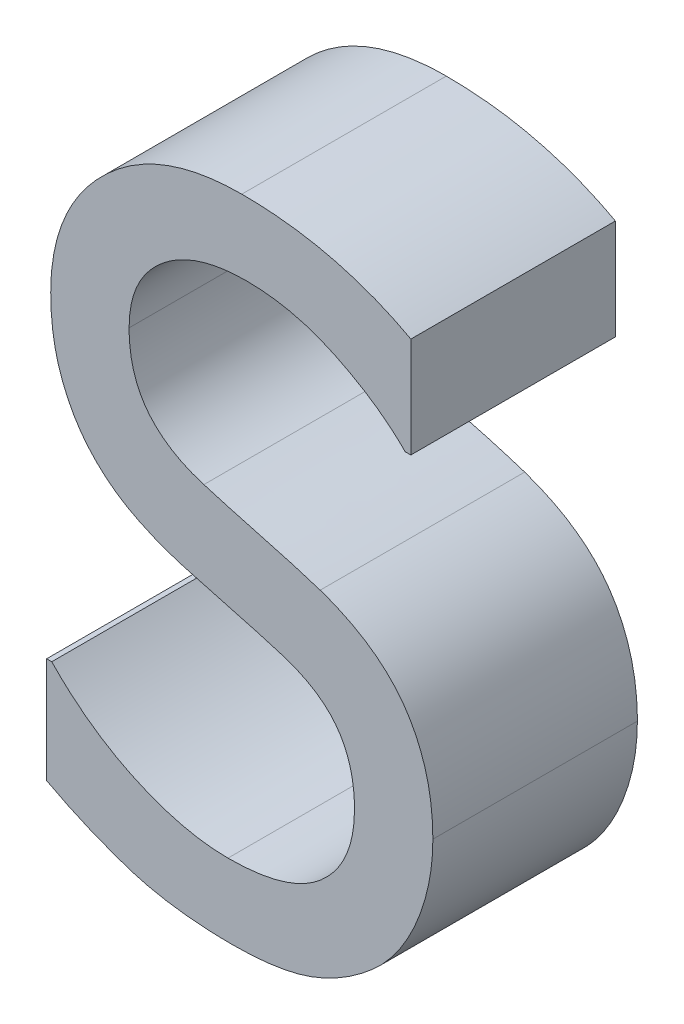
ISO-10303-21;
HEADER;
FILE_DESCRIPTION(('STEP AP214'),'2;1');
FILE_NAME('part.step','',(''),(''),'','','');
FILE_SCHEMA(('AUTOMOTIVE_DESIGN { 1 0 10303 214 1 1 1 1 }'));
ENDSEC;
DATA;
#1=APPLICATION_CONTEXT('core data for automotive mechanical design processes');
#2=APPLICATION_PROTOCOL_DEFINITION('international standard','automotive_design',2000,#1);
#3=PRODUCT_CONTEXT('',#1,'mechanical');
#4=PRODUCT('Part','Part','',(#3));
#5=PRODUCT_RELATED_PRODUCT_CATEGORY('part','',(#4));
#6=PRODUCT_DEFINITION_FORMATION('','',#4);
#7=PRODUCT_DEFINITION_CONTEXT('part definition',#1,'design');
#8=PRODUCT_DEFINITION('design','',#6,#7);
#9=PRODUCT_DEFINITION_SHAPE('','',#8);
#10=(LENGTH_UNIT() NAMED_UNIT(*) SI_UNIT(.MILLI.,.METRE.));
#11=(NAMED_UNIT(*) PLANE_ANGLE_UNIT() SI_UNIT($,.RADIAN.));
#12=(NAMED_UNIT(*) SI_UNIT($,.STERADIAN.) SOLID_ANGLE_UNIT());
#13=UNCERTAINTY_MEASURE_WITH_UNIT(LENGTH_MEASURE(1.E-05),#10,'distance_accuracy_value','');
#14=(GEOMETRIC_REPRESENTATION_CONTEXT(3) GLOBAL_UNCERTAINTY_ASSIGNED_CONTEXT((#13)) GLOBAL_UNIT_ASSIGNED_CONTEXT((#10,
#11,#12)) REPRESENTATION_CONTEXT('',''));
#15=CARTESIAN_POINT('',(0.,0.,0.));
#16=DIRECTION('',(0.,0.,1.));
#17=DIRECTION('',(1.,0.,0.));
#18=AXIS2_PLACEMENT_3D('',#15,#16,#17);
#19=CARTESIAN_POINT('',(-4.806021455057,0.259564190548368,0.));
#20=DIRECTION('',(-1.,0.,0.));
#21=DIRECTION('',(0.,-1.,0.));
#22=AXIS2_PLACEMENT_3D('',#19,#20,#21);
#23=PLANE('',#22);
#24=DIRECTION('',(0.,1.,0.));
#25=VECTOR('',#24,1.);
#26=CARTESIAN_POINT('',(-4.806021455057,0.20796348708896,0.));
#27=LINE('',#26,#25);
#28=CARTESIAN_POINT('',(-4.806021455057,0.20796348708896,0.));
#29=VERTEX_POINT('',#28);
#30=CARTESIAN_POINT('',(-4.806021455057,0.259564190548368,0.));
#31=VERTEX_POINT('',#30);
#32=EDGE_CURVE('E11',#29,#31,#27,.T.);
#33=ORIENTED_EDGE('',*,*,#32,.F.);
#34=DIRECTION('',(0.,0.,1.));
#35=VECTOR('',#34,1.);
#36=CARTESIAN_POINT('',(-4.806021455057,0.20796348708896,0.));
#37=LINE('',#36,#35);
#38=CARTESIAN_POINT('',(-4.806021455057,0.20796348708896,0.1));
#39=VERTEX_POINT('',#38);
#40=EDGE_CURVE('E24',#29,#39,#37,.T.);
#41=ORIENTED_EDGE('',*,*,#40,.T.);
#42=DIRECTION('',(0.,-1.,0.));
#43=VECTOR('',#42,1.);
#44=CARTESIAN_POINT('',(-4.806021455057,0.20796348708896,0.1));
#45=LINE('',#44,#43);
#46=CARTESIAN_POINT('',(-4.806021455057,0.259564190548368,0.1));
#47=VERTEX_POINT('',#46);
#48=EDGE_CURVE('E172',#47,#39,#45,.T.);
#49=ORIENTED_EDGE('',*,*,#48,.F.);
#50=DIRECTION('',(0.,0.,1.));
#51=VECTOR('',#50,1.);
#52=CARTESIAN_POINT('',(-4.806021455057,0.259564190548368,0.));
#53=LINE('',#52,#51);
#54=EDGE_CURVE('E469',#31,#47,#53,.T.);
#55=ORIENTED_EDGE('',*,*,#54,.F.);
#56=EDGE_LOOP('',(#33,#41,#49,#55));
#57=FACE_BOUND('',#56,.T.);
#58=ADVANCED_FACE('F17',(#57),#23,.T.);
#59=CARTESIAN_POINT('',(-4.80351656654,0.259564190548368,0.));
#60=DIRECTION('',(0.,1.,0.));
#61=DIRECTION('',(-1.,0.,0.));
#62=AXIS2_PLACEMENT_3D('',#59,#60,#61);
#63=PLANE('',#62);
#64=DIRECTION('',(1.,0.,0.));
#65=VECTOR('',#64,1.);
#66=CARTESIAN_POINT('',(-4.806021455057,0.259564190548368,0.));
#67=LINE('',#66,#65);
#68=CARTESIAN_POINT('',(-4.80351656654,0.259564190548368,0.));
#69=VERTEX_POINT('',#68);
#70=EDGE_CURVE('E467',#31,#69,#67,.T.);
#71=ORIENTED_EDGE('',*,*,#70,.F.);
#72=ORIENTED_EDGE('',*,*,#54,.T.);
#73=DIRECTION('',(-1.,0.,0.));
#74=VECTOR('',#73,1.);
#75=CARTESIAN_POINT('',(-4.806021455057,0.259564190548368,0.1));
#76=LINE('',#75,#74);
#77=CARTESIAN_POINT('',(-4.80351656654,0.259564190548368,0.1));
#78=VERTEX_POINT('',#77);
#79=EDGE_CURVE('E465',#78,#47,#76,.T.);
#80=ORIENTED_EDGE('',*,*,#79,.F.);
#81=DIRECTION('',(0.,0.,1.));
#82=VECTOR('',#81,1.);
#83=CARTESIAN_POINT('',(-4.80351656654,0.259564190548368,0.));
#84=LINE('',#83,#82);
#85=EDGE_CURVE('E459',#69,#78,#84,.T.);
#86=ORIENTED_EDGE('',*,*,#85,.F.);
#87=EDGE_LOOP('',(#71,#72,#80,#86));
#88=FACE_BOUND('',#87,.T.);
#89=ADVANCED_FACE('F539',(#88),#63,.T.);
#90=CARTESIAN_POINT('',(-4.717348401539,0.219485974269216,0.));
#91=CARTESIAN_POINT('',(-4.717348401539,0.219485974269216,0.1));
#92=CARTESIAN_POINT('',(-4.738890442789,0.219485974269216,0.));
#93=CARTESIAN_POINT('',(-4.738890442789,0.219485974269216,0.1));
#94=CARTESIAN_POINT('',(-4.785230880362,0.240527037815771,0.));
#95=CARTESIAN_POINT('',(-4.785230880362,0.240527037815771,0.1));
#96=CARTESIAN_POINT('',(-4.80351656654,0.259564190548368,0.));
#97=CARTESIAN_POINT('',(-4.80351656654,0.259564190548368,0.1));
#98=B_SPLINE_SURFACE_WITH_KNOTS('',2,1,((#90,#91),(#92,#93),(#94,#95),(#96,#97)),.UNSPECIFIED.,
.F.,.F.,.F.,(3,1,3),(2,2),(-2.,-1.,0.),(0.,0.01),.UNSPECIFIED.);
#99=CARTESIAN_POINT('',(-4.80351656654,0.259564190548368,0.));
#100=CARTESIAN_POINT('',(-4.785230880362,0.240527037815771,0.));
#101=CARTESIAN_POINT('',(-4.738890442789,0.219485974269216,0.));
#102=CARTESIAN_POINT('',(-4.717348401539,0.219485974269216,0.));
#103=B_SPLINE_CURVE_WITH_KNOTS('',2,(#99,#100,#101,#102),.UNSPECIFIED.,.F.,.F.,(3,1,3),(0.,1.,
2.),.UNSPECIFIED.);
#104=CARTESIAN_POINT('',(-4.717348401539,0.219485974269216,0.));
#105=VERTEX_POINT('',#104);
#106=EDGE_CURVE('E452',#69,#105,#103,.T.);
#107=CARTESIAN_POINT('',(-4.717348401539,0.219485974269216,0.1));
#108=CARTESIAN_POINT('',(-4.738890442789,0.219485974269216,0.1));
#109=CARTESIAN_POINT('',(-4.785230880362,0.240527037815771,0.1));
#110=CARTESIAN_POINT('',(-4.80351656654,0.259564190548368,0.1));
#111=B_SPLINE_CURVE_WITH_KNOTS('',2,(#107,#108,#109,#110),.UNSPECIFIED.,.F.,.F.,(3,1,3),(-2.,
-1.,0.),.UNSPECIFIED.);
#112=CARTESIAN_POINT('',(-4.717348401539,0.219485974269216,0.1));
#113=VERTEX_POINT('',#112);
#114=EDGE_CURVE('E447',#113,#78,#111,.T.);
#115=DIRECTION('',(0.,0.,1.));
#116=VECTOR('',#115,1.);
#117=CARTESIAN_POINT('',(-4.717348401539,0.219485974269216,0.));
#118=LINE('',#117,#116);
#119=EDGE_CURVE('E441',#105,#113,#118,.T.);
#120=ORIENTED_EDGE('',*,*,#106,.F.);
#121=ORIENTED_EDGE('',*,*,#85,.T.);
#122=ORIENTED_EDGE('',*,*,#114,.F.);
#123=ORIENTED_EDGE('',*,*,#119,.F.);
#124=EDGE_LOOP('',(#120,#121,#122,#123));
#125=FACE_BOUND('',#124,.T.);
#126=ADVANCED_FACE('F535',(#125),#98,.T.);
#127=CARTESIAN_POINT('',(-4.655477655158,0.271086677728624,0.));
#128=CARTESIAN_POINT('',(-4.655477655158,0.271086677728624,0.1));
#129=CARTESIAN_POINT('',(-4.655477655158,0.247791214516367,0.));
#130=CARTESIAN_POINT('',(-4.655477655158,0.247791214516367,0.1));
#131=CARTESIAN_POINT('',(-4.686788761627,0.219485974269216,0.));
#132=CARTESIAN_POINT('',(-4.686788761627,0.219485974269216,0.1));
#133=CARTESIAN_POINT('',(-4.717348401539,0.219485974269216,0.));
#134=CARTESIAN_POINT('',(-4.717348401539,0.219485974269216,0.1));
#135=B_SPLINE_SURFACE_WITH_KNOTS('',2,1,((#127,#128),(#129,#130),(#131,#132),(#133,#134)),
.UNSPECIFIED.,.F.,.F.,.F.,(3,1,3),(2,2),(-2.,-1.,0.),(0.,0.01),.UNSPECIFIED.);
#136=CARTESIAN_POINT('',(-4.717348401539,0.219485974269216,0.));
#137=CARTESIAN_POINT('',(-4.686788761627,0.219485974269216,0.));
#138=CARTESIAN_POINT('',(-4.655477655158,0.247791214516367,0.));
#139=CARTESIAN_POINT('',(-4.655477655158,0.271086677728624,0.));
#140=B_SPLINE_CURVE_WITH_KNOTS('',2,(#136,#137,#138,#139),.UNSPECIFIED.,.F.,.F.,(3,1,3),(0.,1.,
2.),.UNSPECIFIED.);
#141=CARTESIAN_POINT('',(-4.655477655158,0.271086677728624,0.));
#142=VERTEX_POINT('',#141);
#143=EDGE_CURVE('E434',#105,#142,#140,.T.);
#144=CARTESIAN_POINT('',(-4.655477655158,0.271086677728624,0.1));
#145=CARTESIAN_POINT('',(-4.655477655158,0.247791214516367,0.1));
#146=CARTESIAN_POINT('',(-4.686788761627,0.219485974269216,0.1));
#147=CARTESIAN_POINT('',(-4.717348401539,0.219485974269216,0.1));
#148=B_SPLINE_CURVE_WITH_KNOTS('',2,(#144,#145,#146,#147),.UNSPECIFIED.,.F.,.F.,(3,1,3),(-2.,
-1.,0.),.UNSPECIFIED.);
#149=CARTESIAN_POINT('',(-4.655477655158,0.271086677728624,0.1));
#150=VERTEX_POINT('',#149);
#151=EDGE_CURVE('E429',#150,#113,#148,.T.);
#152=DIRECTION('',(0.,0.,1.));
#153=VECTOR('',#152,1.);
#154=CARTESIAN_POINT('',(-4.655477655158,0.271086677728624,0.));
#155=LINE('',#154,#153);
#156=EDGE_CURVE('E423',#142,#150,#155,.T.);
#157=ORIENTED_EDGE('',*,*,#143,.F.);
#158=ORIENTED_EDGE('',*,*,#119,.T.);
#159=ORIENTED_EDGE('',*,*,#151,.F.);
#160=ORIENTED_EDGE('',*,*,#156,.F.);
#161=EDGE_LOOP('',(#157,#158,#159,#160));
#162=FACE_BOUND('',#161,.T.);
#163=ADVANCED_FACE('F531',(#162),#135,.T.);
#164=CARTESIAN_POINT('',(-4.689794627847,0.318429070708373,0.));
#165=CARTESIAN_POINT('',(-4.689794627847,0.318429070708373,0.1));
#166=CARTESIAN_POINT('',(-4.672009919374,0.312667827118244,0.));
#167=CARTESIAN_POINT('',(-4.672009919374,0.312667827118244,0.1));
#168=CARTESIAN_POINT('',(-4.655477655158,0.289622852757732,0.));
#169=CARTESIAN_POINT('',(-4.655477655158,0.289622852757732,0.1));
#170=CARTESIAN_POINT('',(-4.655477655158,0.271086677728624,0.));
#171=CARTESIAN_POINT('',(-4.655477655158,0.271086677728624,0.1));
#172=B_SPLINE_SURFACE_WITH_KNOTS('',2,1,((#164,#165),(#166,#167),(#168,#169),(#170,#171)),
.UNSPECIFIED.,.F.,.F.,.F.,(3,1,3),(2,2),(-2.,-1.,0.),(0.,0.01),.UNSPECIFIED.);
#173=CARTESIAN_POINT('',(-4.655477655158,0.271086677728624,0.));
#174=CARTESIAN_POINT('',(-4.655477655158,0.289622852757732,0.));
#175=CARTESIAN_POINT('',(-4.672009919374,0.312667827118244,0.));
#176=CARTESIAN_POINT('',(-4.689794627847,0.318429070708373,0.));
#177=B_SPLINE_CURVE_WITH_KNOTS('',2,(#173,#174,#175,#176),.UNSPECIFIED.,.F.,.F.,(3,1,3),(0.,1.,
2.),.UNSPECIFIED.);
#178=CARTESIAN_POINT('',(-4.689794627847,0.318429070708373,0.));
#179=VERTEX_POINT('',#178);
#180=EDGE_CURVE('E416',#142,#179,#177,.T.);
#181=CARTESIAN_POINT('',(-4.689794627847,0.318429070708373,0.1));
#182=CARTESIAN_POINT('',(-4.672009919374,0.312667827118244,0.1));
#183=CARTESIAN_POINT('',(-4.655477655158,0.289622852757732,0.1));
#184=CARTESIAN_POINT('',(-4.655477655158,0.271086677728624,0.1));
#185=B_SPLINE_CURVE_WITH_KNOTS('',2,(#181,#182,#183,#184),.UNSPECIFIED.,.F.,.F.,(3,1,3),(-2.,
-1.,0.),.UNSPECIFIED.);
#186=CARTESIAN_POINT('',(-4.689794627847,0.318429070708373,0.1));
#187=VERTEX_POINT('',#186);
#188=EDGE_CURVE('E411',#187,#150,#185,.T.);
#189=DIRECTION('',(0.,0.,1.));
#190=VECTOR('',#189,1.);
#191=CARTESIAN_POINT('',(-4.689794627847,0.318429070708373,0.));
#192=LINE('',#191,#190);
#193=EDGE_CURVE('E405',#179,#187,#192,.T.);
#194=ORIENTED_EDGE('',*,*,#180,.F.);
#195=ORIENTED_EDGE('',*,*,#156,.T.);
#196=ORIENTED_EDGE('',*,*,#188,.F.);
#197=ORIENTED_EDGE('',*,*,#193,.F.);
#198=EDGE_LOOP('',(#194,#195,#196,#197));
#199=FACE_BOUND('',#198,.T.);
#200=ADVANCED_FACE('F527',(#199),#172,.T.);
#201=CARTESIAN_POINT('',(-4.740142887048,0.332456446406076,0.));
#202=CARTESIAN_POINT('',(-4.740142887048,0.332456446406076,0.1));
#203=CARTESIAN_POINT('',(-4.724111600536,0.327947647074671,0.));
#204=CARTESIAN_POINT('',(-4.724111600536,0.327947647074671,0.1));
#205=CARTESIAN_POINT('',(-4.702820048138,0.322436892336288,0.));
#206=CARTESIAN_POINT('',(-4.702820048138,0.322436892336288,0.1));
#207=CARTESIAN_POINT('',(-4.689794627847,0.318429070708373,0.));
#208=CARTESIAN_POINT('',(-4.689794627847,0.318429070708373,0.1));
#209=B_SPLINE_SURFACE_WITH_KNOTS('',2,1,((#201,#202),(#203,#204),(#205,#206),(#207,#208)),
.UNSPECIFIED.,.F.,.F.,.F.,(3,1,3),(2,2),(-2.,-1.,0.),(0.,0.01),.UNSPECIFIED.);
#210=CARTESIAN_POINT('',(-4.689794627847,0.318429070708373,0.));
#211=CARTESIAN_POINT('',(-4.702820048138,0.322436892336288,0.));
#212=CARTESIAN_POINT('',(-4.724111600536,0.327947647074671,0.));
#213=CARTESIAN_POINT('',(-4.740142887048,0.332456446406076,0.));
#214=B_SPLINE_CURVE_WITH_KNOTS('',2,(#210,#211,#212,#213),.UNSPECIFIED.,.F.,.F.,(3,1,3),(0.,1.,
2.),.UNSPECIFIED.);
#215=CARTESIAN_POINT('',(-4.740142887048,0.332456446406076,0.));
#216=VERTEX_POINT('',#215);
#217=EDGE_CURVE('E398',#179,#216,#214,.T.);
#218=CARTESIAN_POINT('',(-4.740142887048,0.332456446406076,0.1));
#219=CARTESIAN_POINT('',(-4.724111600536,0.327947647074671,0.1));
#220=CARTESIAN_POINT('',(-4.702820048138,0.322436892336288,0.1));
#221=CARTESIAN_POINT('',(-4.689794627847,0.318429070708373,0.1));
#222=B_SPLINE_CURVE_WITH_KNOTS('',2,(#218,#219,#220,#221),.UNSPECIFIED.,.F.,.F.,(3,1,3),(-2.,
-1.,0.),.UNSPECIFIED.);
#223=CARTESIAN_POINT('',(-4.740142887048,0.332456446406076,0.1));
#224=VERTEX_POINT('',#223);
#225=EDGE_CURVE('E393',#224,#187,#222,.T.);
#226=DIRECTION('',(0.,0.,1.));
#227=VECTOR('',#226,1.);
#228=CARTESIAN_POINT('',(-4.740142887048,0.332456446406076,0.));
#229=LINE('',#228,#227);
#230=EDGE_CURVE('E387',#216,#224,#229,.T.);
#231=ORIENTED_EDGE('',*,*,#217,.F.);
#232=ORIENTED_EDGE('',*,*,#193,.T.);
#233=ORIENTED_EDGE('',*,*,#225,.F.);
#234=ORIENTED_EDGE('',*,*,#230,.F.);
#235=EDGE_LOOP('',(#231,#232,#233,#234));
#236=FACE_BOUND('',#235,.T.);
#237=ADVANCED_FACE('F523',(#236),#209,.T.);
#238=CARTESIAN_POINT('',(-4.785982346917,0.359759731246248,0.));
#239=CARTESIAN_POINT('',(-4.785982346917,0.359759731246248,0.1));
#240=CARTESIAN_POINT('',(-4.777215237106,0.349489688324715,0.));
#241=CARTESIAN_POINT('',(-4.777215237106,0.349489688324715,0.1));
#242=CARTESIAN_POINT('',(-4.754420751598,0.336714756885736,0.));
#243=CARTESIAN_POINT('',(-4.754420751598,0.336714756885736,0.1));
#244=CARTESIAN_POINT('',(-4.740142887048,0.332456446406076,0.));
#245=CARTESIAN_POINT('',(-4.740142887048,0.332456446406076,0.1));
#246=B_SPLINE_SURFACE_WITH_KNOTS('',2,1,((#238,#239),(#240,#241),(#242,#243),(#244,#245)),
.UNSPECIFIED.,.F.,.F.,.F.,(3,1,3),(2,2),(-2.,-1.,0.),(0.,0.01),.UNSPECIFIED.);
#247=CARTESIAN_POINT('',(-4.740142887048,0.332456446406076,0.));
#248=CARTESIAN_POINT('',(-4.754420751598,0.336714756885736,0.));
#249=CARTESIAN_POINT('',(-4.777215237106,0.349489688324715,0.));
#250=CARTESIAN_POINT('',(-4.785982346917,0.359759731246248,0.));
#251=B_SPLINE_CURVE_WITH_KNOTS('',2,(#247,#248,#249,#250),.UNSPECIFIED.,.F.,.F.,(3,1,3),(0.,1.,
2.),.UNSPECIFIED.);
#252=CARTESIAN_POINT('',(-4.785982346917,0.359759731246248,0.));
#253=VERTEX_POINT('',#252);
#254=EDGE_CURVE('E380',#216,#253,#251,.T.);
#255=CARTESIAN_POINT('',(-4.785982346917,0.359759731246248,0.1));
#256=CARTESIAN_POINT('',(-4.777215237106,0.349489688324715,0.1));
#257=CARTESIAN_POINT('',(-4.754420751598,0.336714756885736,0.1));
#258=CARTESIAN_POINT('',(-4.740142887048,0.332456446406076,0.1));
#259=B_SPLINE_CURVE_WITH_KNOTS('',2,(#255,#256,#257,#258),.UNSPECIFIED.,.F.,.F.,(3,1,3),(-2.,
-1.,0.),.UNSPECIFIED.);
#260=CARTESIAN_POINT('',(-4.785982346917,0.359759731246248,0.1));
#261=VERTEX_POINT('',#260);
#262=EDGE_CURVE('E375',#261,#224,#259,.T.);
#263=DIRECTION('',(0.,0.,1.));
#264=VECTOR('',#263,1.);
#265=CARTESIAN_POINT('',(-4.785982346917,0.359759731246248,0.));
#266=LINE('',#265,#264);
#267=EDGE_CURVE('E369',#253,#261,#266,.T.);
#268=ORIENTED_EDGE('',*,*,#254,.F.);
#269=ORIENTED_EDGE('',*,*,#230,.T.);
#270=ORIENTED_EDGE('',*,*,#262,.F.);
#271=ORIENTED_EDGE('',*,*,#267,.F.);
#272=EDGE_LOOP('',(#268,#269,#270,#271));
#273=FACE_BOUND('',#272,.T.);
#274=ADVANCED_FACE('F519',(#273),#246,.T.);
#275=CARTESIAN_POINT('',(-4.804017544243,0.415618745185316,0.));
#276=CARTESIAN_POINT('',(-4.804017544243,0.415618745185316,0.1));
#277=CARTESIAN_POINT('',(-4.804017544243,0.397583547859698,0.));
#278=CARTESIAN_POINT('',(-4.804017544243,0.397583547859698,0.1));
#279=CARTESIAN_POINT('',(-4.794498967877,0.370029774167781,0.));
#280=CARTESIAN_POINT('',(-4.794498967877,0.370029774167781,0.1));
#281=CARTESIAN_POINT('',(-4.785982346917,0.359759731246248,0.));
#282=CARTESIAN_POINT('',(-4.785982346917,0.359759731246248,0.1));
#283=B_SPLINE_SURFACE_WITH_KNOTS('',2,1,((#275,#276),(#277,#278),(#279,#280),(#281,#282)),
.UNSPECIFIED.,.F.,.F.,.F.,(3,1,3),(2,2),(-2.,-1.,0.),(0.,0.01),.UNSPECIFIED.);
#284=CARTESIAN_POINT('',(-4.785982346917,0.359759731246248,0.));
#285=CARTESIAN_POINT('',(-4.794498967877,0.370029774167781,0.));
#286=CARTESIAN_POINT('',(-4.804017544243,0.397583547859698,0.));
#287=CARTESIAN_POINT('',(-4.804017544243,0.415618745185316,0.));
#288=B_SPLINE_CURVE_WITH_KNOTS('',2,(#284,#285,#286,#287),.UNSPECIFIED.,.F.,.F.,(3,1,3),(0.,1.,
2.),.UNSPECIFIED.);
#289=CARTESIAN_POINT('',(-4.804017544243,0.415618745185316,0.));
#290=VERTEX_POINT('',#289);
#291=EDGE_CURVE('E362',#253,#290,#288,.T.);
#292=CARTESIAN_POINT('',(-4.804017544243,0.415618745185316,0.1));
#293=CARTESIAN_POINT('',(-4.804017544243,0.397583547859698,0.1));
#294=CARTESIAN_POINT('',(-4.794498967877,0.370029774167781,0.1));
#295=CARTESIAN_POINT('',(-4.785982346917,0.359759731246248,0.1));
#296=B_SPLINE_CURVE_WITH_KNOTS('',2,(#292,#293,#294,#295),.UNSPECIFIED.,.F.,.F.,(3,1,3),(-2.,
-1.,0.),.UNSPECIFIED.);
#297=CARTESIAN_POINT('',(-4.804017544243,0.415618745185316,0.1));
#298=VERTEX_POINT('',#297);
#299=EDGE_CURVE('E357',#298,#261,#296,.T.);
#300=DIRECTION('',(0.,0.,1.));
#301=VECTOR('',#300,1.);
#302=CARTESIAN_POINT('',(-4.804017544243,0.415618745185316,0.));
#303=LINE('',#302,#301);
#304=EDGE_CURVE('E351',#290,#298,#303,.T.);
#305=ORIENTED_EDGE('',*,*,#291,.F.);
#306=ORIENTED_EDGE('',*,*,#267,.T.);
#307=ORIENTED_EDGE('',*,*,#299,.F.);
#308=ORIENTED_EDGE('',*,*,#304,.F.);
#309=EDGE_LOOP('',(#305,#306,#307,#308));
#310=FACE_BOUND('',#309,.T.);
#311=ADVANCED_FACE('F515',(#310),#283,.T.);
#312=CARTESIAN_POINT('',(-4.710585202542,0.504041309851195,0.));
#313=CARTESIAN_POINT('',(-4.710585202542,0.504041309851195,0.1));
#314=CARTESIAN_POINT('',(-4.751414885377,0.504041309851195,0.));
#315=CARTESIAN_POINT('',(-4.751414885377,0.504041309851195,0.1));
#316=CARTESIAN_POINT('',(-4.804017544243,0.453192072947021,0.));
#317=CARTESIAN_POINT('',(-4.804017544243,0.453192072947021,0.1));
#318=CARTESIAN_POINT('',(-4.804017544243,0.415618745185316,0.));
#319=CARTESIAN_POINT('',(-4.804017544243,0.415618745185316,0.1));
#320=B_SPLINE_SURFACE_WITH_KNOTS('',2,1,((#312,#313),(#314,#315),(#316,#317),(#318,#319)),
.UNSPECIFIED.,.F.,.F.,.F.,(3,1,3),(2,2),(-2.,-1.,0.),(0.,0.01),.UNSPECIFIED.);
#321=CARTESIAN_POINT('',(-4.804017544243,0.415618745185316,0.));
#322=CARTESIAN_POINT('',(-4.804017544243,0.453192072947021,0.));
#323=CARTESIAN_POINT('',(-4.751414885377,0.504041309851195,0.));
#324=CARTESIAN_POINT('',(-4.710585202542,0.504041309851195,0.));
#325=B_SPLINE_CURVE_WITH_KNOTS('',2,(#321,#322,#323,#324),.UNSPECIFIED.,.F.,.F.,(3,1,3),(0.,1.,
2.),.UNSPECIFIED.);
#326=CARTESIAN_POINT('',(-4.710585202542,0.504041309851195,0.));
#327=VERTEX_POINT('',#326);
#328=EDGE_CURVE('E344',#290,#327,#325,.T.);
#329=CARTESIAN_POINT('',(-4.710585202542,0.504041309851195,0.1));
#330=CARTESIAN_POINT('',(-4.751414885377,0.504041309851195,0.1));
#331=CARTESIAN_POINT('',(-4.804017544243,0.453192072947021,0.1));
#332=CARTESIAN_POINT('',(-4.804017544243,0.415618745185316,0.1));
#333=B_SPLINE_CURVE_WITH_KNOTS('',2,(#329,#330,#331,#332),.UNSPECIFIED.,.F.,.F.,(3,1,3),(-2.,
-1.,0.),.UNSPECIFIED.);
#334=CARTESIAN_POINT('',(-4.710585202542,0.504041309851195,0.1));
#335=VERTEX_POINT('',#334);
#336=EDGE_CURVE('E339',#335,#298,#333,.T.);
#337=DIRECTION('',(0.,0.,1.));
#338=VECTOR('',#337,1.);
#339=CARTESIAN_POINT('',(-4.710585202542,0.504041309851195,0.));
#340=LINE('',#339,#338);
#341=EDGE_CURVE('E333',#327,#335,#340,.T.);
#342=ORIENTED_EDGE('',*,*,#328,.F.);
#343=ORIENTED_EDGE('',*,*,#304,.T.);
#344=ORIENTED_EDGE('',*,*,#336,.F.);
#345=ORIENTED_EDGE('',*,*,#341,.F.);
#346=EDGE_LOOP('',(#342,#343,#344,#345));
#347=FACE_BOUND('',#346,.T.);
#348=ADVANCED_FACE('F511',(#347),#320,.T.);
#349=CARTESIAN_POINT('',(-4.627923881467,0.484002201711619,0.));
#350=CARTESIAN_POINT('',(-4.627923881467,0.484002201711619,0.1));
#351=CARTESIAN_POINT('',(-4.64570858994,0.493771266929662,0.));
#352=CARTESIAN_POINT('',(-4.64570858994,0.493771266929662,0.1));
#353=CARTESIAN_POINT('',(-4.68728973933,0.504041309851195,0.));
#354=CARTESIAN_POINT('',(-4.68728973933,0.504041309851195,0.1));
#355=CARTESIAN_POINT('',(-4.710585202542,0.504041309851195,0.));
#356=CARTESIAN_POINT('',(-4.710585202542,0.504041309851195,0.1));
#357=B_SPLINE_SURFACE_WITH_KNOTS('',2,1,((#349,#350),(#351,#352),(#353,#354),(#355,#356)),
.UNSPECIFIED.,.F.,.F.,.F.,(3,1,3),(2,2),(-2.,-1.,0.),(0.,0.01),.UNSPECIFIED.);
#358=CARTESIAN_POINT('',(-4.710585202542,0.504041309851195,0.));
#359=CARTESIAN_POINT('',(-4.68728973933,0.504041309851195,0.));
#360=CARTESIAN_POINT('',(-4.64570858994,0.493771266929662,0.));
#361=CARTESIAN_POINT('',(-4.627923881467,0.484002201711619,0.));
#362=B_SPLINE_CURVE_WITH_KNOTS('',2,(#358,#359,#360,#361),.UNSPECIFIED.,.F.,.F.,(3,1,3),(0.,1.,
2.),.UNSPECIFIED.);
#363=CARTESIAN_POINT('',(-4.627923881467,0.484002201711619,0.));
#364=VERTEX_POINT('',#363);
#365=EDGE_CURVE('E326',#327,#364,#362,.T.);
#366=CARTESIAN_POINT('',(-4.627923881467,0.484002201711619,0.1));
#367=CARTESIAN_POINT('',(-4.64570858994,0.493771266929662,0.1));
#368=CARTESIAN_POINT('',(-4.68728973933,0.504041309851195,0.1));
#369=CARTESIAN_POINT('',(-4.710585202542,0.504041309851195,0.1));
#370=B_SPLINE_CURVE_WITH_KNOTS('',2,(#366,#367,#368,#369),.UNSPECIFIED.,.F.,.F.,(3,1,3),(-2.,
-1.,0.),.UNSPECIFIED.);
#371=CARTESIAN_POINT('',(-4.627923881467,0.484002201711619,0.1));
#372=VERTEX_POINT('',#371);
#373=EDGE_CURVE('E321',#372,#335,#370,.T.);
#374=DIRECTION('',(0.,0.,1.));
#375=VECTOR('',#374,1.);
#376=CARTESIAN_POINT('',(-4.627923881467,0.484002201711619,0.));
#377=LINE('',#376,#375);
#378=EDGE_CURVE('E318',#364,#372,#377,.T.);
#379=ORIENTED_EDGE('',*,*,#365,.F.);
#380=ORIENTED_EDGE('',*,*,#341,.T.);
#381=ORIENTED_EDGE('',*,*,#373,.F.);
#382=ORIENTED_EDGE('',*,*,#378,.F.);
#383=EDGE_LOOP('',(#379,#380,#381,#382));
#384=FACE_BOUND('',#383,.T.);
#385=ADVANCED_FACE('F507',(#384),#357,.T.);
#386=CARTESIAN_POINT('',(-4.627923881467,0.434906386769658,0.));
#387=DIRECTION('',(1.,0.,0.));
#388=DIRECTION('',(0.,1.,0.));
#389=AXIS2_PLACEMENT_3D('',#386,#387,#388);
#390=PLANE('',#389);
#391=DIRECTION('',(0.,-1.,0.));
#392=VECTOR('',#391,1.);
#393=CARTESIAN_POINT('',(-4.627923881467,0.484002201711619,0.));
#394=LINE('',#393,#392);
#395=CARTESIAN_POINT('',(-4.627923881467,0.434906386769658,0.));
#396=VERTEX_POINT('',#395);
#397=EDGE_CURVE('E316',#364,#396,#394,.T.);
#398=ORIENTED_EDGE('',*,*,#397,.F.);
#399=ORIENTED_EDGE('',*,*,#378,.T.);
#400=DIRECTION('',(0.,1.,0.));
#401=VECTOR('',#400,1.);
#402=CARTESIAN_POINT('',(-4.627923881467,0.484002201711619,0.1));
#403=LINE('',#402,#401);
#404=CARTESIAN_POINT('',(-4.627923881467,0.434906386769658,0.1));
#405=VERTEX_POINT('',#404);
#406=EDGE_CURVE('E313',#405,#372,#403,.T.);
#407=ORIENTED_EDGE('',*,*,#406,.F.);
#408=DIRECTION('',(0.,0.,1.));
#409=VECTOR('',#408,1.);
#410=CARTESIAN_POINT('',(-4.627923881467,0.434906386769658,0.));
#411=LINE('',#410,#409);
#412=EDGE_CURVE('E310',#396,#405,#411,.T.);
#413=ORIENTED_EDGE('',*,*,#412,.F.);
#414=EDGE_LOOP('',(#398,#399,#407,#413));
#415=FACE_BOUND('',#414,.T.);
#416=ADVANCED_FACE('F503',(#415),#390,.T.);
#417=CARTESIAN_POINT('',(-4.630679258836,0.434906386769658,0.));
#418=DIRECTION('',(0.,-1.,0.));
#419=DIRECTION('',(1.,0.,0.));
#420=AXIS2_PLACEMENT_3D('',#417,#418,#419);
#421=PLANE('',#420);
#422=DIRECTION('',(-1.,0.,0.));
#423=VECTOR('',#422,1.);
#424=CARTESIAN_POINT('',(-4.627923881467,0.434906386769658,0.));
#425=LINE('',#424,#423);
#426=CARTESIAN_POINT('',(-4.630679258836,0.434906386769658,0.));
#427=VERTEX_POINT('',#426);
#428=EDGE_CURVE('E308',#396,#427,#425,.T.);
#429=ORIENTED_EDGE('',*,*,#428,.F.);
#430=ORIENTED_EDGE('',*,*,#412,.T.);
#431=DIRECTION('',(1.,0.,0.));
#432=VECTOR('',#431,1.);
#433=CARTESIAN_POINT('',(-4.627923881467,0.434906386769658,0.1));
#434=LINE('',#433,#432);
#435=CARTESIAN_POINT('',(-4.630679258836,0.434906386769658,0.1));
#436=VERTEX_POINT('',#435);
#437=EDGE_CURVE('E305',#436,#405,#434,.T.);
#438=ORIENTED_EDGE('',*,*,#437,.F.);
#439=DIRECTION('',(0.,0.,1.));
#440=VECTOR('',#439,1.);
#441=CARTESIAN_POINT('',(-4.630679258836,0.434906386769658,0.));
#442=LINE('',#441,#440);
#443=EDGE_CURVE('E299',#427,#436,#442,.T.);
#444=ORIENTED_EDGE('',*,*,#443,.F.);
#445=EDGE_LOOP('',(#429,#430,#438,#444));
#446=FACE_BOUND('',#445,.T.);
#447=ADVANCED_FACE('F499',(#446),#421,.T.);
#448=CARTESIAN_POINT('',(-4.708080314025,0.468471892903448,0.));
#449=CARTESIAN_POINT('',(-4.708080314025,0.468471892903448,0.1));
#450=CARTESIAN_POINT('',(-4.685536317368,0.468471892903448,0.));
#451=CARTESIAN_POINT('',(-4.685536317368,0.468471892903448,0.1));
#452=CARTESIAN_POINT('',(-4.643955167978,0.448432784763872,0.));
#453=CARTESIAN_POINT('',(-4.643955167978,0.448432784763872,0.1));
#454=CARTESIAN_POINT('',(-4.630679258836,0.434906386769658,0.));
#455=CARTESIAN_POINT('',(-4.630679258836,0.434906386769658,0.1));
#456=B_SPLINE_SURFACE_WITH_KNOTS('',2,1,((#448,#449),(#450,#451),(#452,#453),(#454,#455)),
.UNSPECIFIED.,.F.,.F.,.F.,(3,1,3),(2,2),(-2.,-1.,0.),(0.,0.01),.UNSPECIFIED.);
#457=CARTESIAN_POINT('',(-4.630679258836,0.434906386769658,0.));
#458=CARTESIAN_POINT('',(-4.643955167978,0.448432784763872,0.));
#459=CARTESIAN_POINT('',(-4.685536317368,0.468471892903448,0.));
#460=CARTESIAN_POINT('',(-4.708080314025,0.468471892903448,0.));
#461=B_SPLINE_CURVE_WITH_KNOTS('',2,(#457,#458,#459,#460),.UNSPECIFIED.,.F.,.F.,(3,1,3),(0.,1.,
2.),.UNSPECIFIED.);
#462=CARTESIAN_POINT('',(-4.708080314025,0.468471892903448,0.));
#463=VERTEX_POINT('',#462);
#464=EDGE_CURVE('E292',#427,#463,#461,.T.);
#465=CARTESIAN_POINT('',(-4.708080314025,0.468471892903448,0.1));
#466=CARTESIAN_POINT('',(-4.685536317368,0.468471892903448,0.1));
#467=CARTESIAN_POINT('',(-4.643955167978,0.448432784763872,0.1));
#468=CARTESIAN_POINT('',(-4.630679258836,0.434906386769658,0.1));
#469=B_SPLINE_CURVE_WITH_KNOTS('',2,(#465,#466,#467,#468),.UNSPECIFIED.,.F.,.F.,(3,1,3),(-2.,
-1.,0.),.UNSPECIFIED.);
#470=CARTESIAN_POINT('',(-4.708080314025,0.468471892903448,0.1));
#471=VERTEX_POINT('',#470);
#472=EDGE_CURVE('E287',#471,#436,#469,.T.);
#473=DIRECTION('',(0.,0.,1.));
#474=VECTOR('',#473,1.);
#475=CARTESIAN_POINT('',(-4.708080314025,0.468471892903448,0.));
#476=LINE('',#475,#474);
#477=EDGE_CURVE('E281',#463,#471,#476,.T.);
#478=ORIENTED_EDGE('',*,*,#464,.F.);
#479=ORIENTED_EDGE('',*,*,#443,.T.);
#480=ORIENTED_EDGE('',*,*,#472,.F.);
#481=ORIENTED_EDGE('',*,*,#477,.F.);
#482=EDGE_LOOP('',(#478,#479,#480,#481));
#483=FACE_BOUND('',#482,.T.);
#484=ADVANCED_FACE('F495',(#483),#456,.T.);
#485=CARTESIAN_POINT('',(-4.765692749926,0.419877055664976,0.));
#486=CARTESIAN_POINT('',(-4.765692749926,0.419877055664976,0.1));
#487=CARTESIAN_POINT('',(-4.765692749926,0.441669585766765,0.));
#488=CARTESIAN_POINT('',(-4.765692749926,0.441669585766765,0.1));
#489=CARTESIAN_POINT('',(-4.733880665755,0.468471892903448,0.));
#490=CARTESIAN_POINT('',(-4.733880665755,0.468471892903448,0.1));
#491=CARTESIAN_POINT('',(-4.708080314025,0.468471892903448,0.));
#492=CARTESIAN_POINT('',(-4.708080314025,0.468471892903448,0.1));
#493=B_SPLINE_SURFACE_WITH_KNOTS('',2,1,((#485,#486),(#487,#488),(#489,#490),(#491,#492)),
.UNSPECIFIED.,.F.,.F.,.F.,(3,1,3),(2,2),(-2.,-1.,0.),(0.,0.01),.UNSPECIFIED.);
#494=CARTESIAN_POINT('',(-4.708080314025,0.468471892903448,0.));
#495=CARTESIAN_POINT('',(-4.733880665755,0.468471892903448,0.));
#496=CARTESIAN_POINT('',(-4.765692749926,0.441669585766765,0.));
#497=CARTESIAN_POINT('',(-4.765692749926,0.419877055664976,0.));
#498=B_SPLINE_CURVE_WITH_KNOTS('',2,(#494,#495,#496,#497),.UNSPECIFIED.,.F.,.F.,(3,1,3),(0.,1.,
2.),.UNSPECIFIED.);
#499=CARTESIAN_POINT('',(-4.765692749926,0.419877055664976,0.));
#500=VERTEX_POINT('',#499);
#501=EDGE_CURVE('E274',#463,#500,#498,.T.);
#502=CARTESIAN_POINT('',(-4.765692749926,0.419877055664976,0.1));
#503=CARTESIAN_POINT('',(-4.765692749926,0.441669585766765,0.1));
#504=CARTESIAN_POINT('',(-4.733880665755,0.468471892903448,0.1));
#505=CARTESIAN_POINT('',(-4.708080314025,0.468471892903448,0.1));
#506=B_SPLINE_CURVE_WITH_KNOTS('',2,(#502,#503,#504,#505),.UNSPECIFIED.,.F.,.F.,(3,1,3),(-2.,
-1.,0.),.UNSPECIFIED.);
#507=CARTESIAN_POINT('',(-4.765692749926,0.419877055664976,0.1));
#508=VERTEX_POINT('',#507);
#509=EDGE_CURVE('E269',#508,#471,#506,.T.);
#510=DIRECTION('',(0.,0.,1.));
#511=VECTOR('',#510,1.);
#512=CARTESIAN_POINT('',(-4.765692749926,0.419877055664976,0.));
#513=LINE('',#512,#511);
#514=EDGE_CURVE('E263',#500,#508,#513,.T.);
#515=ORIENTED_EDGE('',*,*,#501,.F.);
#516=ORIENTED_EDGE('',*,*,#477,.T.);
#517=ORIENTED_EDGE('',*,*,#509,.F.);
#518=ORIENTED_EDGE('',*,*,#514,.F.);
#519=EDGE_LOOP('',(#515,#516,#517,#518));
#520=FACE_BOUND('',#519,.T.);
#521=ADVANCED_FACE('F491',(#520),#493,.T.);
#522=CARTESIAN_POINT('',(-4.729121377571,0.371783196129994,0.));
#523=CARTESIAN_POINT('',(-4.729121377571,0.371783196129994,0.1));
#524=CARTESIAN_POINT('',(-4.746906086045,0.377043462016632,0.));
#525=CARTESIAN_POINT('',(-4.746906086045,0.377043462016632,0.1));
#526=CARTESIAN_POINT('',(-4.765692749926,0.400338925228889,0.));
#527=CARTESIAN_POINT('',(-4.765692749926,0.400338925228889,0.1));
#528=CARTESIAN_POINT('',(-4.765692749926,0.419877055664976,0.));
#529=CARTESIAN_POINT('',(-4.765692749926,0.419877055664976,0.1));
#530=B_SPLINE_SURFACE_WITH_KNOTS('',2,1,((#522,#523),(#524,#525),(#526,#527),(#528,#529)),
.UNSPECIFIED.,.F.,.F.,.F.,(3,1,3),(2,2),(-2.,-1.,0.),(0.,0.01),.UNSPECIFIED.);
#531=CARTESIAN_POINT('',(-4.765692749926,0.419877055664976,0.));
#532=CARTESIAN_POINT('',(-4.765692749926,0.400338925228889,0.));
#533=CARTESIAN_POINT('',(-4.746906086045,0.377043462016632,0.));
#534=CARTESIAN_POINT('',(-4.729121377571,0.371783196129994,0.));
#535=B_SPLINE_CURVE_WITH_KNOTS('',2,(#531,#532,#533,#534),.UNSPECIFIED.,.F.,.F.,(3,1,3),(0.,1.,
2.),.UNSPECIFIED.);
#536=CARTESIAN_POINT('',(-4.729121377571,0.371783196129994,0.));
#537=VERTEX_POINT('',#536);
#538=EDGE_CURVE('E256',#500,#537,#535,.T.);
#539=CARTESIAN_POINT('',(-4.729121377571,0.371783196129994,0.1));
#540=CARTESIAN_POINT('',(-4.746906086045,0.377043462016632,0.1));
#541=CARTESIAN_POINT('',(-4.765692749926,0.400338925228889,0.1));
#542=CARTESIAN_POINT('',(-4.765692749926,0.419877055664976,0.1));
#543=B_SPLINE_CURVE_WITH_KNOTS('',2,(#539,#540,#541,#542),.UNSPECIFIED.,.F.,.F.,(3,1,3),(-2.,
-1.,0.),.UNSPECIFIED.);
#544=CARTESIAN_POINT('',(-4.729121377571,0.371783196129994,0.1));
#545=VERTEX_POINT('',#544);
#546=EDGE_CURVE('E251',#545,#508,#543,.T.);
#547=DIRECTION('',(0.,0.,1.));
#548=VECTOR('',#547,1.);
#549=CARTESIAN_POINT('',(-4.729121377571,0.371783196129994,0.));
#550=LINE('',#549,#548);
#551=EDGE_CURVE('E245',#537,#545,#550,.T.);
#552=ORIENTED_EDGE('',*,*,#538,.F.);
#553=ORIENTED_EDGE('',*,*,#514,.T.);
#554=ORIENTED_EDGE('',*,*,#546,.F.);
#555=ORIENTED_EDGE('',*,*,#551,.F.);
#556=EDGE_LOOP('',(#552,#553,#554,#555));
#557=FACE_BOUND('',#556,.T.);
#558=ADVANCED_FACE('F487',(#557),#530,.T.);
#559=CARTESIAN_POINT('',(-4.672260408225,0.355501420766588,0.));
#560=CARTESIAN_POINT('',(-4.672260408225,0.355501420766588,0.1));
#561=CARTESIAN_POINT('',(-4.683532406554,0.359258753542759,0.));
#562=CARTESIAN_POINT('',(-4.683532406554,0.359258753542759,0.1));
#563=CARTESIAN_POINT('',(-4.717598890391,0.368276352205568,0.));
#564=CARTESIAN_POINT('',(-4.717598890391,0.368276352205568,0.1));
#565=CARTESIAN_POINT('',(-4.729121377571,0.371783196129994,0.));
#566=CARTESIAN_POINT('',(-4.729121377571,0.371783196129994,0.1));
#567=B_SPLINE_SURFACE_WITH_KNOTS('',2,1,((#559,#560),(#561,#562),(#563,#564),(#565,#566)),
.UNSPECIFIED.,.F.,.F.,.F.,(3,1,3),(2,2),(-2.,-1.,0.),(0.,0.01),.UNSPECIFIED.);
#568=CARTESIAN_POINT('',(-4.729121377571,0.371783196129994,0.));
#569=CARTESIAN_POINT('',(-4.717598890391,0.368276352205568,0.));
#570=CARTESIAN_POINT('',(-4.683532406554,0.359258753542759,0.));
#571=CARTESIAN_POINT('',(-4.672260408225,0.355501420766588,0.));
#572=B_SPLINE_CURVE_WITH_KNOTS('',2,(#568,#569,#570,#571),.UNSPECIFIED.,.F.,.F.,(3,1,3),(0.,1.,
2.),.UNSPECIFIED.);
#573=CARTESIAN_POINT('',(-4.672260408225,0.355501420766588,0.));
#574=VERTEX_POINT('',#573);
#575=EDGE_CURVE('E238',#537,#574,#572,.T.);
#576=CARTESIAN_POINT('',(-4.672260408225,0.355501420766588,0.1));
#577=CARTESIAN_POINT('',(-4.683532406554,0.359258753542759,0.1));
#578=CARTESIAN_POINT('',(-4.717598890391,0.368276352205568,0.1));
#579=CARTESIAN_POINT('',(-4.729121377571,0.371783196129994,0.1));
#580=B_SPLINE_CURVE_WITH_KNOTS('',2,(#576,#577,#578,#579),.UNSPECIFIED.,.F.,.F.,(3,1,3),(-2.,
-1.,0.),.UNSPECIFIED.);
#581=CARTESIAN_POINT('',(-4.672260408225,0.355501420766588,0.1));
#582=VERTEX_POINT('',#581);
#583=EDGE_CURVE('E233',#582,#545,#580,.T.);
#584=DIRECTION('',(0.,0.,1.));
#585=VECTOR('',#584,1.);
#586=CARTESIAN_POINT('',(-4.672260408225,0.355501420766588,0.));
#587=LINE('',#586,#585);
#588=EDGE_CURVE('E227',#574,#582,#587,.T.);
#589=ORIENTED_EDGE('',*,*,#575,.F.);
#590=ORIENTED_EDGE('',*,*,#551,.T.);
#591=ORIENTED_EDGE('',*,*,#583,.F.);
#592=ORIENTED_EDGE('',*,*,#588,.F.);
#593=EDGE_LOOP('',(#589,#590,#591,#592));
#594=FACE_BOUND('',#593,.T.);
#595=ADVANCED_FACE('F483',(#594),#567,.T.);
#596=CARTESIAN_POINT('',(-4.617152860842,0.277599387873987,0.));
#597=CARTESIAN_POINT('',(-4.617152860842,0.277599387873987,0.1));
#598=CARTESIAN_POINT('',(-4.617152860842,0.306405605824627,0.));
#599=CARTESIAN_POINT('',(-4.617152860842,0.306405605824627,0.1));
#600=CARTESIAN_POINT('',(-4.643704679126,0.345732355548545,0.));
#601=CARTESIAN_POINT('',(-4.643704679126,0.345732355548545,0.1));
#602=CARTESIAN_POINT('',(-4.672260408225,0.355501420766588,0.));
#603=CARTESIAN_POINT('',(-4.672260408225,0.355501420766588,0.1));
#604=B_SPLINE_SURFACE_WITH_KNOTS('',2,1,((#596,#597),(#598,#599),(#600,#601),(#602,#603)),
.UNSPECIFIED.,.F.,.F.,.F.,(3,1,3),(2,2),(-2.,-1.,0.),(0.,0.01),.UNSPECIFIED.);
#605=CARTESIAN_POINT('',(-4.672260408225,0.355501420766588,0.));
#606=CARTESIAN_POINT('',(-4.643704679126,0.345732355548545,0.));
#607=CARTESIAN_POINT('',(-4.617152860842,0.306405605824627,0.));
#608=CARTESIAN_POINT('',(-4.617152860842,0.277599387873987,0.));
#609=B_SPLINE_CURVE_WITH_KNOTS('',2,(#605,#606,#607,#608),.UNSPECIFIED.,.F.,.F.,(3,1,3),(0.,1.,
2.),.UNSPECIFIED.);
#610=CARTESIAN_POINT('',(-4.617152860842,0.277599387873987,0.));
#611=VERTEX_POINT('',#610);
#612=EDGE_CURVE('E220',#574,#611,#609,.T.);
#613=CARTESIAN_POINT('',(-4.617152860842,0.277599387873987,0.1));
#614=CARTESIAN_POINT('',(-4.617152860842,0.306405605824627,0.1));
#615=CARTESIAN_POINT('',(-4.643704679126,0.345732355548545,0.1));
#616=CARTESIAN_POINT('',(-4.672260408225,0.355501420766588,0.1));
#617=B_SPLINE_CURVE_WITH_KNOTS('',2,(#613,#614,#615,#616),.UNSPECIFIED.,.F.,.F.,(3,1,3),(-2.,
-1.,0.),.UNSPECIFIED.);
#618=CARTESIAN_POINT('',(-4.617152860842,0.277599387873987,0.1));
#619=VERTEX_POINT('',#618);
#620=EDGE_CURVE('E215',#619,#582,#617,.T.);
#621=DIRECTION('',(0.,0.,1.));
#622=VECTOR('',#621,1.);
#623=CARTESIAN_POINT('',(-4.617152860842,0.277599387873987,0.));
#624=LINE('',#623,#622);
#625=EDGE_CURVE('E209',#611,#619,#624,.T.);
#626=ORIENTED_EDGE('',*,*,#612,.F.);
#627=ORIENTED_EDGE('',*,*,#588,.T.);
#628=ORIENTED_EDGE('',*,*,#620,.F.);
#629=ORIENTED_EDGE('',*,*,#625,.F.);
#630=EDGE_LOOP('',(#626,#627,#628,#629));
#631=FACE_BOUND('',#630,.T.);
#632=ADVANCED_FACE('F479',(#631),#604,.T.);
#633=CARTESIAN_POINT('',(-4.642201746016,0.211971308716875,0.));
#634=CARTESIAN_POINT('',(-4.642201746016,0.211971308716875,0.1));
#635=CARTESIAN_POINT('',(-4.630428769984,0.224245262452365,0.));
#636=CARTESIAN_POINT('',(-4.630428769984,0.224245262452365,0.1));
#637=CARTESIAN_POINT('',(-4.617152860842,0.259313701696623,0.));
#638=CARTESIAN_POINT('',(-4.617152860842,0.259313701696623,0.1));
#639=CARTESIAN_POINT('',(-4.617152860842,0.277599387873987,0.));
#640=CARTESIAN_POINT('',(-4.617152860842,0.277599387873987,0.1));
#641=B_SPLINE_SURFACE_WITH_KNOTS('',2,1,((#633,#634),(#635,#636),(#637,#638),(#639,#640)),
.UNSPECIFIED.,.F.,.F.,.F.,(3,1,3),(2,2),(-2.,-1.,0.),(0.,0.01),.UNSPECIFIED.);
#642=CARTESIAN_POINT('',(-4.617152860842,0.277599387873987,0.));
#643=CARTESIAN_POINT('',(-4.617152860842,0.259313701696623,0.));
#644=CARTESIAN_POINT('',(-4.630428769984,0.224245262452365,0.));
#645=CARTESIAN_POINT('',(-4.642201746016,0.211971308716875,0.));
#646=B_SPLINE_CURVE_WITH_KNOTS('',2,(#642,#643,#644,#645),.UNSPECIFIED.,.F.,.F.,(3,1,3),(0.,1.,
2.),.UNSPECIFIED.);
#647=CARTESIAN_POINT('',(-4.642201746016,0.211971308716875,0.));
#648=VERTEX_POINT('',#647);
#649=EDGE_CURVE('E202',#611,#648,#646,.T.);
#650=CARTESIAN_POINT('',(-4.642201746016,0.211971308716875,0.1));
#651=CARTESIAN_POINT('',(-4.630428769984,0.224245262452365,0.1));
#652=CARTESIAN_POINT('',(-4.617152860842,0.259313701696623,0.1));
#653=CARTESIAN_POINT('',(-4.617152860842,0.277599387873987,0.1));
#654=B_SPLINE_CURVE_WITH_KNOTS('',2,(#650,#651,#652,#653),.UNSPECIFIED.,.F.,.F.,(3,1,3),(-2.,
-1.,0.),.UNSPECIFIED.);
#655=CARTESIAN_POINT('',(-4.642201746016,0.211971308716875,0.1));
#656=VERTEX_POINT('',#655);
#657=EDGE_CURVE('E198',#656,#619,#654,.T.);
#658=DIRECTION('',(0.,0.,1.));
#659=VECTOR('',#658,1.);
#660=CARTESIAN_POINT('',(-4.642201746016,0.211971308716875,0.));
#661=LINE('',#660,#659);
#662=EDGE_CURVE('E157',#648,#656,#661,.T.);
#663=ORIENTED_EDGE('',*,*,#649,.F.);
#664=ORIENTED_EDGE('',*,*,#625,.T.);
#665=ORIENTED_EDGE('',*,*,#657,.F.);
#666=ORIENTED_EDGE('',*,*,#662,.F.);
#667=EDGE_LOOP('',(#663,#664,#665,#666));
#668=FACE_BOUND('',#667,.T.);
#669=ADVANCED_FACE('F477',(#668),#641,.T.);
#670=CARTESIAN_POINT('',(-4.714843513022,0.183916557321469,0.));
#671=CARTESIAN_POINT('',(-4.714843513022,0.183916557321469,0.1));
#672=CARTESIAN_POINT('',(-4.689544138996,0.183916557321469,0.));
#673=CARTESIAN_POINT('',(-4.689544138996,0.183916557321469,0.1));
#674=CARTESIAN_POINT('',(-4.65572814401,0.198444910722661,0.));
#675=CARTESIAN_POINT('',(-4.65572814401,0.198444910722661,0.1));
#676=CARTESIAN_POINT('',(-4.642201746016,0.211971308716875,0.));
#677=CARTESIAN_POINT('',(-4.642201746016,0.211971308716875,0.1));
#678=B_SPLINE_SURFACE_WITH_KNOTS('',2,1,((#670,#671),(#672,#673),(#674,#675),(#676,#677)),
.UNSPECIFIED.,.F.,.F.,.F.,(3,1,3),(2,2),(-2.,-1.,0.),(0.,0.01),.UNSPECIFIED.);
#679=CARTESIAN_POINT('',(-4.642201746016,0.211971308716875,0.));
#680=CARTESIAN_POINT('',(-4.65572814401,0.198444910722661,0.));
#681=CARTESIAN_POINT('',(-4.689544138996,0.183916557321469,0.));
#682=CARTESIAN_POINT('',(-4.714843513022,0.183916557321469,0.));
#683=B_SPLINE_CURVE_WITH_KNOTS('',2,(#679,#680,#681,#682),.UNSPECIFIED.,.F.,.F.,(3,1,3),(0.,1.,
2.),.UNSPECIFIED.);
#684=CARTESIAN_POINT('',(-4.714843513022,0.183916557321469,0.));
#685=VERTEX_POINT('',#684);
#686=EDGE_CURVE('E161',#648,#685,#683,.T.);
#687=CARTESIAN_POINT('',(-4.714843513022,0.183916557321469,0.1));
#688=CARTESIAN_POINT('',(-4.689544138996,0.183916557321469,0.1));
#689=CARTESIAN_POINT('',(-4.65572814401,0.198444910722661,0.1));
#690=CARTESIAN_POINT('',(-4.642201746016,0.211971308716875,0.1));
#691=B_SPLINE_CURVE_WITH_KNOTS('',2,(#687,#688,#689,#690),.UNSPECIFIED.,.F.,.F.,(3,1,3),(-2.,
-1.,0.),.UNSPECIFIED.);
#692=CARTESIAN_POINT('',(-4.714843513022,0.183916557321469,0.1));
#693=VERTEX_POINT('',#692);
#694=EDGE_CURVE('E150',#693,#656,#691,.T.);
#695=DIRECTION('',(0.,0.,1.));
#696=VECTOR('',#695,1.);
#697=CARTESIAN_POINT('',(-4.714843513022,0.183916557321469,0.));
#698=LINE('',#697,#696);
#699=EDGE_CURVE('E154',#685,#693,#698,.T.);
#700=ORIENTED_EDGE('',*,*,#686,.F.);
#701=ORIENTED_EDGE('',*,*,#662,.T.);
#702=ORIENTED_EDGE('',*,*,#694,.F.);
#703=ORIENTED_EDGE('',*,*,#699,.F.);
#704=EDGE_LOOP('',(#700,#701,#702,#703));
#705=FACE_BOUND('',#704,.T.);
#706=ADVANCED_FACE('F153',(#705),#678,.T.);
#707=CARTESIAN_POINT('',(-4.806021455057,0.20796348708896,0.));
#708=CARTESIAN_POINT('',(-4.806021455057,0.20796348708896,0.1));
#709=CARTESIAN_POINT('',(-4.787485280028,0.197943933019172,0.));
#710=CARTESIAN_POINT('',(-4.787485280028,0.197943933019172,0.1));
#711=CARTESIAN_POINT('',(-4.745152664083,0.183916557321469,0.));
#712=CARTESIAN_POINT('',(-4.745152664083,0.183916557321469,0.1));
#713=CARTESIAN_POINT('',(-4.714843513022,0.183916557321469,0.));
#714=CARTESIAN_POINT('',(-4.714843513022,0.183916557321469,0.1));
#715=B_SPLINE_SURFACE_WITH_KNOTS('',2,1,((#707,#708),(#709,#710),(#711,#712),(#713,#714)),
.UNSPECIFIED.,.F.,.F.,.F.,(3,1,3),(2,2),(-2.,-1.,0.),(0.,0.01),.UNSPECIFIED.);
#716=CARTESIAN_POINT('',(-4.714843513022,0.183916557321469,0.));
#717=CARTESIAN_POINT('',(-4.745152664083,0.183916557321469,0.));
#718=CARTESIAN_POINT('',(-4.787485280028,0.197943933019172,0.));
#719=CARTESIAN_POINT('',(-4.806021455057,0.20796348708896,0.));
#720=B_SPLINE_CURVE_WITH_KNOTS('',2,(#716,#717,#718,#719),.UNSPECIFIED.,.F.,.F.,(3,1,3),(0.,1.,
2.),.UNSPECIFIED.);
#721=EDGE_CURVE('E167',#685,#29,#720,.T.);
#722=CARTESIAN_POINT('',(-4.806021455057,0.20796348708896,0.1));
#723=CARTESIAN_POINT('',(-4.787485280028,0.197943933019172,0.1));
#724=CARTESIAN_POINT('',(-4.745152664083,0.183916557321469,0.1));
#725=CARTESIAN_POINT('',(-4.714843513022,0.183916557321469,0.1));
#726=B_SPLINE_CURVE_WITH_KNOTS('',2,(#722,#723,#724,#725),.UNSPECIFIED.,.F.,.F.,(3,1,3),(-2.,
-1.,0.),.UNSPECIFIED.);
#727=EDGE_CURVE('E166',#39,#693,#726,.T.);
#728=ORIENTED_EDGE('',*,*,#721,.F.);
#729=ORIENTED_EDGE('',*,*,#699,.T.);
#730=ORIENTED_EDGE('',*,*,#727,.F.);
#731=ORIENTED_EDGE('',*,*,#40,.F.);
#732=EDGE_LOOP('',(#728,#729,#730,#731));
#733=FACE_BOUND('',#732,.T.);
#734=ADVANCED_FACE('F165',(#733),#715,.T.);
#735=CARTESIAN_POINT('',(-4.713019388883,0.34195513192344,0.));
#736=DIRECTION('',(0.,0.,1.));
#737=DIRECTION('',(1.,0.,0.));
#738=AXIS2_PLACEMENT_3D('',#735,#736,#737);
#739=PLANE('',#738);
#740=ORIENTED_EDGE('',*,*,#721,.T.);
#741=ORIENTED_EDGE('',*,*,#32,.T.);
#742=ORIENTED_EDGE('',*,*,#70,.T.);
#743=ORIENTED_EDGE('',*,*,#106,.T.);
#744=ORIENTED_EDGE('',*,*,#143,.T.);
#745=ORIENTED_EDGE('',*,*,#180,.T.);
#746=ORIENTED_EDGE('',*,*,#217,.T.);
#747=ORIENTED_EDGE('',*,*,#254,.T.);
#748=ORIENTED_EDGE('',*,*,#291,.T.);
#749=ORIENTED_EDGE('',*,*,#328,.T.);
#750=ORIENTED_EDGE('',*,*,#365,.T.);
#751=ORIENTED_EDGE('',*,*,#397,.T.);
#752=ORIENTED_EDGE('',*,*,#428,.T.);
#753=ORIENTED_EDGE('',*,*,#464,.T.);
#754=ORIENTED_EDGE('',*,*,#501,.T.);
#755=ORIENTED_EDGE('',*,*,#538,.T.);
#756=ORIENTED_EDGE('',*,*,#575,.T.);
#757=ORIENTED_EDGE('',*,*,#612,.T.);
#758=ORIENTED_EDGE('',*,*,#649,.T.);
#759=ORIENTED_EDGE('',*,*,#686,.T.);
#760=EDGE_LOOP('',(#740,#741,#742,#743,#744,#745,#746,#747,#748,#749,#750,#751,#752,#753,#754,
#755,#756,#757,#758,#759));
#761=FACE_BOUND('',#760,.T.);
#762=ADVANCED_FACE('F472',(#761),#739,.F.);
#763=CARTESIAN_POINT('',(-4.713019388883,0.34195513192344,0.1));
#764=DIRECTION('',(0.,0.,1.));
#765=DIRECTION('',(1.,0.,0.));
#766=AXIS2_PLACEMENT_3D('',#763,#764,#765);
#767=PLANE('',#766);
#768=ORIENTED_EDGE('',*,*,#727,.T.);
#769=ORIENTED_EDGE('',*,*,#694,.T.);
#770=ORIENTED_EDGE('',*,*,#657,.T.);
#771=ORIENTED_EDGE('',*,*,#620,.T.);
#772=ORIENTED_EDGE('',*,*,#583,.T.);
#773=ORIENTED_EDGE('',*,*,#546,.T.);
#774=ORIENTED_EDGE('',*,*,#509,.T.);
#775=ORIENTED_EDGE('',*,*,#472,.T.);
#776=ORIENTED_EDGE('',*,*,#437,.T.);
#777=ORIENTED_EDGE('',*,*,#406,.T.);
#778=ORIENTED_EDGE('',*,*,#373,.T.);
#779=ORIENTED_EDGE('',*,*,#336,.T.);
#780=ORIENTED_EDGE('',*,*,#299,.T.);
#781=ORIENTED_EDGE('',*,*,#262,.T.);
#782=ORIENTED_EDGE('',*,*,#225,.T.);
#783=ORIENTED_EDGE('',*,*,#188,.T.);
#784=ORIENTED_EDGE('',*,*,#151,.T.);
#785=ORIENTED_EDGE('',*,*,#114,.T.);
#786=ORIENTED_EDGE('',*,*,#79,.T.);
#787=ORIENTED_EDGE('',*,*,#48,.T.);
#788=EDGE_LOOP('',(#768,#769,#770,#771,#772,#773,#774,#775,#776,#777,#778,#779,#780,#781,#782,
#783,#784,#785,#786,#787));
#789=FACE_BOUND('',#788,.T.);
#790=ADVANCED_FACE('F170',(#789),#767,.T.);
#791=CLOSED_SHELL('',(#58,#89,#126,#163,#200,#237,#274,#311,#348,#385,#416,#447,#484,#521,#558,
#595,#632,#669,#706,#734,#762,#790));
#792=MANIFOLD_SOLID_BREP('B1',#791);
#793=ADVANCED_BREP_SHAPE_REPRESENTATION('',(#18,#792),#14);
#794=SHAPE_DEFINITION_REPRESENTATION(#9,#793);
ENDSEC;
END-ISO-10303-21;
